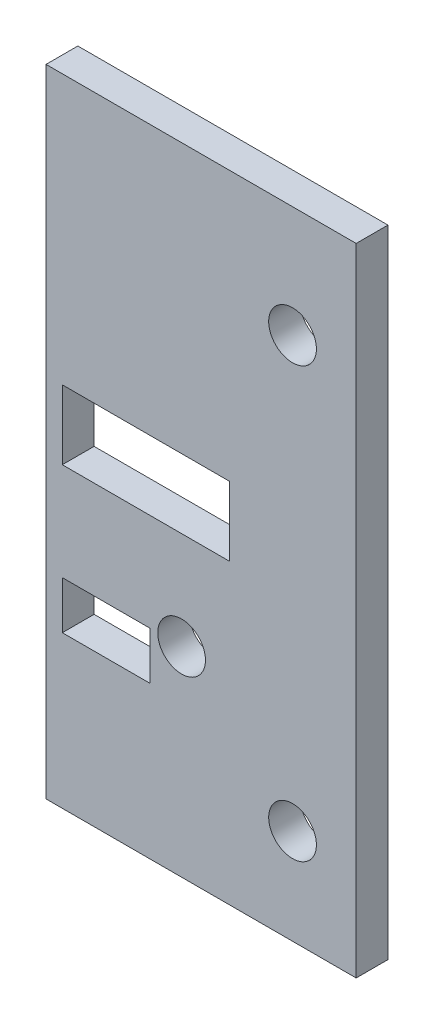
ISO-10303-21;
HEADER;
FILE_DESCRIPTION(('STEP AP214'),'2;1');
FILE_NAME('part.step','',(''),(''),'','','');
FILE_SCHEMA(('AUTOMOTIVE_DESIGN { 1 0 10303 214 1 1 1 1 }'));
ENDSEC;
DATA;
#1=APPLICATION_CONTEXT('core data for automotive mechanical design processes');
#2=APPLICATION_PROTOCOL_DEFINITION('international standard','automotive_design',2000,#1);
#3=PRODUCT_CONTEXT('',#1,'mechanical');
#4=PRODUCT('Part','Part','',(#3));
#5=PRODUCT_RELATED_PRODUCT_CATEGORY('part','',(#4));
#6=PRODUCT_DEFINITION_FORMATION('','',#4);
#7=PRODUCT_DEFINITION_CONTEXT('part definition',#1,'design');
#8=PRODUCT_DEFINITION('design','',#6,#7);
#9=PRODUCT_DEFINITION_SHAPE('','',#8);
#10=(LENGTH_UNIT() NAMED_UNIT(*) SI_UNIT(.MILLI.,.METRE.));
#11=(NAMED_UNIT(*) PLANE_ANGLE_UNIT() SI_UNIT($,.RADIAN.));
#12=(NAMED_UNIT(*) SI_UNIT($,.STERADIAN.) SOLID_ANGLE_UNIT());
#13=UNCERTAINTY_MEASURE_WITH_UNIT(LENGTH_MEASURE(1.E-05),#10,'distance_accuracy_value','');
#14=(GEOMETRIC_REPRESENTATION_CONTEXT(3) GLOBAL_UNCERTAINTY_ASSIGNED_CONTEXT((#13)) GLOBAL_UNIT_ASSIGNED_CONTEXT((#10,
#11,#12)) REPRESENTATION_CONTEXT('',''));
#15=CARTESIAN_POINT('',(0.,0.,0.));
#16=DIRECTION('',(0.,0.,1.));
#17=DIRECTION('',(1.,0.,0.));
#18=AXIS2_PLACEMENT_3D('',#15,#16,#17);
#19=CARTESIAN_POINT('',(0.,0.,2.));
#20=DIRECTION('',(0.,0.,1.));
#21=DIRECTION('',(1.,0.,0.));
#22=AXIS2_PLACEMENT_3D('',#19,#20,#21);
#23=PLANE('',#22);
#24=CARTESIAN_POINT('',(5.75,-14.,2.));
#25=DIRECTION('',(0.,0.,1.));
#26=DIRECTION('',(1.,0.,0.));
#27=AXIS2_PLACEMENT_3D('',#24,#25,#26);
#28=CIRCLE('',#27,1.5);
#29=CARTESIAN_POINT('',(7.25,-14.,2.));
#30=VERTEX_POINT('',#29);
#31=EDGE_CURVE('E324',#30,#30,#28,.T.);
#32=ORIENTED_EDGE('',*,*,#31,.F.);
#33=EDGE_LOOP('',(#32));
#34=FACE_BOUND('',#33,.T.);
#35=CARTESIAN_POINT('',(5.75,13.,2.));
#36=DIRECTION('',(0.,0.,1.));
#37=DIRECTION('',(1.,0.,0.));
#38=AXIS2_PLACEMENT_3D('',#35,#36,#37);
#39=CIRCLE('',#38,1.5);
#40=CARTESIAN_POINT('',(7.25,13.,2.));
#41=VERTEX_POINT('',#40);
#42=EDGE_CURVE('E149',#41,#41,#39,.T.);
#43=ORIENTED_EDGE('',*,*,#42,.F.);
#44=EDGE_LOOP('',(#43));
#45=FACE_BOUND('',#44,.T.);
#46=DIRECTION('',(0.,1.,0.));
#47=VECTOR('',#46,1.);
#48=CARTESIAN_POINT('',(-3.22648049851816,0.,2.));
#49=LINE('',#48,#47);
#50=CARTESIAN_POINT('',(-3.22648049851816,-10.4359985929143,2.));
#51=VERTEX_POINT('',#50);
#52=CARTESIAN_POINT('',(-3.22648049851816,-7.43599859291428,2.));
#53=VERTEX_POINT('',#52);
#54=EDGE_CURVE('E56',#51,#53,#49,.T.);
#55=ORIENTED_EDGE('',*,*,#54,.F.);
#56=DIRECTION('',(-1.,0.,0.));
#57=VECTOR('',#56,1.);
#58=CARTESIAN_POINT('',(0.,-10.4359985929143,2.));
#59=LINE('',#58,#57);
#60=CARTESIAN_POINT('',(-8.72648049851816,-10.4359985929143,2.));
#61=VERTEX_POINT('',#60);
#62=EDGE_CURVE('E143',#51,#61,#59,.T.);
#63=ORIENTED_EDGE('',*,*,#62,.T.);
#64=DIRECTION('',(0.,1.,0.));
#65=VECTOR('',#64,1.);
#66=CARTESIAN_POINT('',(-8.72648049851816,0.,2.));
#67=LINE('',#66,#65);
#68=CARTESIAN_POINT('',(-8.72648049851816,-7.43599859291428,2.));
#69=VERTEX_POINT('',#68);
#70=EDGE_CURVE('E146',#61,#69,#67,.T.);
#71=ORIENTED_EDGE('',*,*,#70,.T.);
#72=DIRECTION('',(-1.,0.,0.));
#73=VECTOR('',#72,1.);
#74=CARTESIAN_POINT('',(0.,-7.43599859291428,2.));
#75=LINE('',#74,#73);
#76=EDGE_CURVE('E155',#53,#69,#75,.T.);
#77=ORIENTED_EDGE('',*,*,#76,.F.);
#78=EDGE_LOOP('',(#55,#63,#71,#77));
#79=FACE_BOUND('',#78,.T.);
#80=CARTESIAN_POINT('',(-1.22648049851816,-7.43599859291428,2.));
#81=DIRECTION('',(0.,0.,1.));
#82=DIRECTION('',(1.,0.,0.));
#83=AXIS2_PLACEMENT_3D('',#80,#81,#82);
#84=CIRCLE('',#83,1.5);
#85=CARTESIAN_POINT('',(0.273519501481839,-7.43599859291428,2.));
#86=VERTEX_POINT('',#85);
#87=EDGE_CURVE('E162',#86,#86,#84,.T.);
#88=ORIENTED_EDGE('',*,*,#87,.F.);
#89=EDGE_LOOP('',(#88));
#90=FACE_BOUND('',#89,.T.);
#91=DIRECTION('',(0.,-1.,0.));
#92=VECTOR('',#91,1.);
#93=CARTESIAN_POINT('',(-9.75,-20.,2.));
#94=LINE('',#93,#92);
#95=CARTESIAN_POINT('',(-9.75,20.,2.));
#96=VERTEX_POINT('',#95);
#97=CARTESIAN_POINT('',(-9.75,-20.,2.));
#98=VERTEX_POINT('',#97);
#99=EDGE_CURVE('E200',#96,#98,#94,.T.);
#100=ORIENTED_EDGE('',*,*,#99,.T.);
#101=DIRECTION('',(1.,0.,0.));
#102=VECTOR('',#101,1.);
#103=CARTESIAN_POINT('',(9.75,-20.,2.));
#104=LINE('',#103,#102);
#105=CARTESIAN_POINT('',(9.75,-20.,2.));
#106=VERTEX_POINT('',#105);
#107=EDGE_CURVE('E203',#98,#106,#104,.T.);
#108=ORIENTED_EDGE('',*,*,#107,.T.);
#109=DIRECTION('',(0.,1.,0.));
#110=VECTOR('',#109,1.);
#111=CARTESIAN_POINT('',(9.75,-20.,2.));
#112=LINE('',#111,#110);
#113=CARTESIAN_POINT('',(9.75,20.,2.));
#114=VERTEX_POINT('',#113);
#115=EDGE_CURVE('E206',#106,#114,#112,.T.);
#116=ORIENTED_EDGE('',*,*,#115,.T.);
#117=DIRECTION('',(-1.,0.,0.));
#118=VECTOR('',#117,1.);
#119=CARTESIAN_POINT('',(9.75,20.,2.));
#120=LINE('',#119,#118);
#121=EDGE_CURVE('E208',#114,#96,#120,.T.);
#122=ORIENTED_EDGE('',*,*,#121,.T.);
#123=EDGE_LOOP('',(#100,#108,#116,#122));
#124=FACE_BOUND('',#123,.T.);
#125=DIRECTION('',(0.,1.,0.));
#126=VECTOR('',#125,1.);
#127=CARTESIAN_POINT('',(1.77351950148184,0.,2.));
#128=LINE('',#127,#126);
#129=CARTESIAN_POINT('',(1.77351950148184,-1.28955750015885,2.));
#130=VERTEX_POINT('',#129);
#131=CARTESIAN_POINT('',(1.77351950148184,3.06400140708572,2.));
#132=VERTEX_POINT('',#131);
#133=EDGE_CURVE('E179',#130,#132,#128,.T.);
#134=ORIENTED_EDGE('',*,*,#133,.F.);
#135=DIRECTION('',(-1.,0.,0.));
#136=VECTOR('',#135,1.);
#137=CARTESIAN_POINT('',(0.,-1.28955750015885,2.));
#138=LINE('',#137,#136);
#139=CARTESIAN_POINT('',(-8.72648049851816,-1.28955750015885,2.));
#140=VERTEX_POINT('',#139);
#141=EDGE_CURVE('E48',#130,#140,#138,.T.);
#142=ORIENTED_EDGE('',*,*,#141,.T.);
#143=DIRECTION('',(0.,1.,0.));
#144=VECTOR('',#143,1.);
#145=CARTESIAN_POINT('',(-8.72648049851816,0.,2.));
#146=LINE('',#145,#144);
#147=CARTESIAN_POINT('',(-8.72648049851816,3.06400140708572,2.));
#148=VERTEX_POINT('',#147);
#149=EDGE_CURVE('E169',#140,#148,#146,.T.);
#150=ORIENTED_EDGE('',*,*,#149,.T.);
#151=DIRECTION('',(-1.,0.,0.));
#152=VECTOR('',#151,1.);
#153=CARTESIAN_POINT('',(0.,3.06400140708572,2.));
#154=LINE('',#153,#152);
#155=EDGE_CURVE('E183',#132,#148,#154,.T.);
#156=ORIENTED_EDGE('',*,*,#155,.F.);
#157=EDGE_LOOP('',(#134,#142,#150,#156));
#158=FACE_BOUND('',#157,.T.);
#159=ADVANCED_FACE('F33',(#34,#45,#79,#90,#124,#158),#23,.T.);
#160=CARTESIAN_POINT('',(0.,0.,0.));
#161=DIRECTION('',(0.,0.,1.));
#162=DIRECTION('',(1.,0.,0.));
#163=AXIS2_PLACEMENT_3D('',#160,#161,#162);
#164=PLANE('',#163);
#165=CARTESIAN_POINT('',(5.75,-14.,0.));
#166=DIRECTION('',(0.,0.,1.));
#167=DIRECTION('',(1.,0.,0.));
#168=AXIS2_PLACEMENT_3D('',#165,#166,#167);
#169=CIRCLE('',#168,1.5);
#170=CARTESIAN_POINT('',(7.25,-14.,0.));
#171=VERTEX_POINT('',#170);
#172=EDGE_CURVE('E180',#171,#171,#169,.T.);
#173=ORIENTED_EDGE('',*,*,#172,.T.);
#174=EDGE_LOOP('',(#173));
#175=FACE_BOUND('',#174,.T.);
#176=CARTESIAN_POINT('',(5.75,13.,0.));
#177=DIRECTION('',(0.,0.,1.));
#178=DIRECTION('',(1.,0.,0.));
#179=AXIS2_PLACEMENT_3D('',#176,#177,#178);
#180=CIRCLE('',#179,1.5);
#181=CARTESIAN_POINT('',(7.25,13.,0.));
#182=VERTEX_POINT('',#181);
#183=EDGE_CURVE('E325',#182,#182,#180,.T.);
#184=ORIENTED_EDGE('',*,*,#183,.T.);
#185=EDGE_LOOP('',(#184));
#186=FACE_BOUND('',#185,.T.);
#187=DIRECTION('',(0.,-1.,0.));
#188=VECTOR('',#187,1.);
#189=CARTESIAN_POINT('',(-9.75,-20.,0.));
#190=LINE('',#189,#188);
#191=CARTESIAN_POINT('',(-9.75,20.,0.));
#192=VERTEX_POINT('',#191);
#193=CARTESIAN_POINT('',(-9.75,-20.,0.));
#194=VERTEX_POINT('',#193);
#195=EDGE_CURVE('E197',#192,#194,#190,.T.);
#196=ORIENTED_EDGE('',*,*,#195,.F.);
#197=DIRECTION('',(-1.,0.,0.));
#198=VECTOR('',#197,1.);
#199=CARTESIAN_POINT('',(9.75,20.,0.));
#200=LINE('',#199,#198);
#201=CARTESIAN_POINT('',(9.75,20.,0.));
#202=VERTEX_POINT('',#201);
#203=EDGE_CURVE('E204',#202,#192,#200,.T.);
#204=ORIENTED_EDGE('',*,*,#203,.F.);
#205=DIRECTION('',(0.,1.,0.));
#206=VECTOR('',#205,1.);
#207=CARTESIAN_POINT('',(9.75,-20.,0.));
#208=LINE('',#207,#206);
#209=CARTESIAN_POINT('',(9.75,-20.,0.));
#210=VERTEX_POINT('',#209);
#211=EDGE_CURVE('E215',#210,#202,#208,.T.);
#212=ORIENTED_EDGE('',*,*,#211,.F.);
#213=DIRECTION('',(1.,0.,0.));
#214=VECTOR('',#213,1.);
#215=CARTESIAN_POINT('',(9.75,-20.,0.));
#216=LINE('',#215,#214);
#217=EDGE_CURVE('E213',#194,#210,#216,.T.);
#218=ORIENTED_EDGE('',*,*,#217,.F.);
#219=EDGE_LOOP('',(#196,#204,#212,#218));
#220=FACE_BOUND('',#219,.T.);
#221=CARTESIAN_POINT('',(-1.22648049851816,-7.43599859291428,0.));
#222=DIRECTION('',(0.,0.,1.));
#223=DIRECTION('',(1.,0.,0.));
#224=AXIS2_PLACEMENT_3D('',#221,#222,#223);
#225=CIRCLE('',#224,1.5);
#226=CARTESIAN_POINT('',(0.273519501481839,-7.43599859291428,0.));
#227=VERTEX_POINT('',#226);
#228=EDGE_CURVE('E194',#227,#227,#225,.T.);
#229=ORIENTED_EDGE('',*,*,#228,.T.);
#230=EDGE_LOOP('',(#229));
#231=FACE_BOUND('',#230,.T.);
#232=DIRECTION('',(-1.,0.,0.));
#233=VECTOR('',#232,1.);
#234=CARTESIAN_POINT('',(0.,-10.4359985929143,0.));
#235=LINE('',#234,#233);
#236=CARTESIAN_POINT('',(-3.22648049851816,-10.4359985929143,0.));
#237=VERTEX_POINT('',#236);
#238=CARTESIAN_POINT('',(-8.72648049851816,-10.4359985929143,0.));
#239=VERTEX_POINT('',#238);
#240=EDGE_CURVE('E131',#237,#239,#235,.T.);
#241=ORIENTED_EDGE('',*,*,#240,.F.);
#242=DIRECTION('',(0.,1.,0.));
#243=VECTOR('',#242,1.);
#244=CARTESIAN_POINT('',(-3.22648049851816,0.,0.));
#245=LINE('',#244,#243);
#246=CARTESIAN_POINT('',(-3.22648049851816,-7.43599859291428,0.));
#247=VERTEX_POINT('',#246);
#248=EDGE_CURVE('E125',#237,#247,#245,.T.);
#249=ORIENTED_EDGE('',*,*,#248,.T.);
#250=DIRECTION('',(-1.,0.,0.));
#251=VECTOR('',#250,1.);
#252=CARTESIAN_POINT('',(0.,-7.43599859291428,0.));
#253=LINE('',#252,#251);
#254=CARTESIAN_POINT('',(-8.72648049851816,-7.43599859291428,0.));
#255=VERTEX_POINT('',#254);
#256=EDGE_CURVE('E134',#247,#255,#253,.T.);
#257=ORIENTED_EDGE('',*,*,#256,.T.);
#258=DIRECTION('',(0.,1.,0.));
#259=VECTOR('',#258,1.);
#260=CARTESIAN_POINT('',(-8.72648049851816,0.,0.));
#261=LINE('',#260,#259);
#262=EDGE_CURVE('E139',#239,#255,#261,.T.);
#263=ORIENTED_EDGE('',*,*,#262,.F.);
#264=EDGE_LOOP('',(#241,#249,#257,#263));
#265=FACE_BOUND('',#264,.T.);
#266=DIRECTION('',(-1.,0.,0.));
#267=VECTOR('',#266,1.);
#268=CARTESIAN_POINT('',(0.,-1.28955750015885,0.));
#269=LINE('',#268,#267);
#270=CARTESIAN_POINT('',(1.77351950148184,-1.28955750015885,0.));
#271=VERTEX_POINT('',#270);
#272=CARTESIAN_POINT('',(-8.72648049851816,-1.28955750015885,0.));
#273=VERTEX_POINT('',#272);
#274=EDGE_CURVE('E166',#271,#273,#269,.T.);
#275=ORIENTED_EDGE('',*,*,#274,.F.);
#276=DIRECTION('',(0.,1.,0.));
#277=VECTOR('',#276,1.);
#278=CARTESIAN_POINT('',(1.77351950148184,0.,0.));
#279=LINE('',#278,#277);
#280=CARTESIAN_POINT('',(1.77351950148184,3.06400140708572,0.));
#281=VERTEX_POINT('',#280);
#282=EDGE_CURVE('E168',#271,#281,#279,.T.);
#283=ORIENTED_EDGE('',*,*,#282,.T.);
#284=DIRECTION('',(-1.,0.,0.));
#285=VECTOR('',#284,1.);
#286=CARTESIAN_POINT('',(0.,3.06400140708572,0.));
#287=LINE('',#286,#285);
#288=CARTESIAN_POINT('',(-8.72648049851816,3.06400140708572,0.));
#289=VERTEX_POINT('',#288);
#290=EDGE_CURVE('E172',#281,#289,#287,.T.);
#291=ORIENTED_EDGE('',*,*,#290,.T.);
#292=DIRECTION('',(0.,1.,0.));
#293=VECTOR('',#292,1.);
#294=CARTESIAN_POINT('',(-8.72648049851816,0.,0.));
#295=LINE('',#294,#293);
#296=EDGE_CURVE('E175',#273,#289,#295,.T.);
#297=ORIENTED_EDGE('',*,*,#296,.F.);
#298=EDGE_LOOP('',(#275,#283,#291,#297));
#299=FACE_BOUND('',#298,.T.);
#300=ADVANCED_FACE('F141',(#175,#186,#220,#231,#265,#299),#164,.F.);
#301=CARTESIAN_POINT('',(-9.75,-20.,2.));
#302=DIRECTION('',(1.,0.,0.));
#303=DIRECTION('',(0.,0.,-1.));
#304=AXIS2_PLACEMENT_3D('',#301,#302,#303);
#305=PLANE('',#304);
#306=ORIENTED_EDGE('',*,*,#195,.T.);
#307=DIRECTION('',(0.,0.,-1.));
#308=VECTOR('',#307,1.);
#309=CARTESIAN_POINT('',(-9.75,-20.,2.));
#310=LINE('',#309,#308);
#311=EDGE_CURVE('E11',#98,#194,#310,.T.);
#312=ORIENTED_EDGE('',*,*,#311,.F.);
#313=ORIENTED_EDGE('',*,*,#99,.F.);
#314=DIRECTION('',(0.,0.,-1.));
#315=VECTOR('',#314,1.);
#316=CARTESIAN_POINT('',(-9.75,20.,2.));
#317=LINE('',#316,#315);
#318=EDGE_CURVE('E210',#96,#192,#317,.T.);
#319=ORIENTED_EDGE('',*,*,#318,.T.);
#320=EDGE_LOOP('',(#306,#312,#313,#319));
#321=FACE_BOUND('',#320,.T.);
#322=ADVANCED_FACE('F35',(#321),#305,.F.);
#323=CARTESIAN_POINT('',(9.75,-20.,2.));
#324=DIRECTION('',(0.,1.,0.));
#325=DIRECTION('',(-1.,0.,0.));
#326=AXIS2_PLACEMENT_3D('',#323,#324,#325);
#327=PLANE('',#326);
#328=ORIENTED_EDGE('',*,*,#217,.T.);
#329=DIRECTION('',(0.,0.,-1.));
#330=VECTOR('',#329,1.);
#331=CARTESIAN_POINT('',(9.75,-20.,2.));
#332=LINE('',#331,#330);
#333=EDGE_CURVE('E41',#106,#210,#332,.T.);
#334=ORIENTED_EDGE('',*,*,#333,.F.);
#335=ORIENTED_EDGE('',*,*,#107,.F.);
#336=ORIENTED_EDGE('',*,*,#311,.T.);
#337=EDGE_LOOP('',(#328,#334,#335,#336));
#338=FACE_BOUND('',#337,.T.);
#339=ADVANCED_FACE('F243',(#338),#327,.F.);
#340=CARTESIAN_POINT('',(9.75,-20.,2.));
#341=DIRECTION('',(-1.,0.,0.));
#342=DIRECTION('',(0.,0.,1.));
#343=AXIS2_PLACEMENT_3D('',#340,#341,#342);
#344=PLANE('',#343);
#345=ORIENTED_EDGE('',*,*,#211,.T.);
#346=DIRECTION('',(0.,0.,-1.));
#347=VECTOR('',#346,1.);
#348=CARTESIAN_POINT('',(9.75,20.,2.));
#349=LINE('',#348,#347);
#350=EDGE_CURVE('E220',#114,#202,#349,.T.);
#351=ORIENTED_EDGE('',*,*,#350,.F.);
#352=ORIENTED_EDGE('',*,*,#115,.F.);
#353=ORIENTED_EDGE('',*,*,#333,.T.);
#354=EDGE_LOOP('',(#345,#351,#352,#353));
#355=FACE_BOUND('',#354,.T.);
#356=ADVANCED_FACE('F227',(#355),#344,.F.);
#357=CARTESIAN_POINT('',(9.75,20.,2.));
#358=DIRECTION('',(0.,-1.,0.));
#359=DIRECTION('',(0.,0.,-1.));
#360=AXIS2_PLACEMENT_3D('',#357,#358,#359);
#361=PLANE('',#360);
#362=ORIENTED_EDGE('',*,*,#203,.T.);
#363=ORIENTED_EDGE('',*,*,#318,.F.);
#364=ORIENTED_EDGE('',*,*,#121,.F.);
#365=ORIENTED_EDGE('',*,*,#350,.T.);
#366=EDGE_LOOP('',(#362,#363,#364,#365));
#367=FACE_BOUND('',#366,.T.);
#368=ADVANCED_FACE('F236',(#367),#361,.F.);
#369=CARTESIAN_POINT('',(-1.22648049851816,-7.43599859291428,0.));
#370=DIRECTION('',(0.,0.,1.));
#371=DIRECTION('',(1.,0.,0.));
#372=AXIS2_PLACEMENT_3D('',#369,#370,#371);
#373=CYLINDRICAL_SURFACE('',#372,1.5);
#374=ORIENTED_EDGE('',*,*,#228,.F.);
#375=EDGE_LOOP('',(#374));
#376=FACE_BOUND('',#375,.T.);
#377=ORIENTED_EDGE('',*,*,#87,.T.);
#378=EDGE_LOOP('',(#377));
#379=FACE_BOUND('',#378,.T.);
#380=ADVANCED_FACE('F261',(#376,#379),#373,.F.);
#381=CARTESIAN_POINT('',(-3.22648049851816,0.,0.));
#382=DIRECTION('',(1.,0.,0.));
#383=DIRECTION('',(0.,0.,-1.));
#384=AXIS2_PLACEMENT_3D('',#381,#382,#383);
#385=PLANE('',#384);
#386=ORIENTED_EDGE('',*,*,#54,.T.);
#387=DIRECTION('',(0.,0.,1.));
#388=VECTOR('',#387,1.);
#389=CARTESIAN_POINT('',(-3.22648049851816,-7.43599859291428,0.));
#390=LINE('',#389,#388);
#391=EDGE_CURVE('E121',#247,#53,#390,.T.);
#392=ORIENTED_EDGE('',*,*,#391,.F.);
#393=ORIENTED_EDGE('',*,*,#248,.F.);
#394=DIRECTION('',(0.,0.,1.));
#395=VECTOR('',#394,1.);
#396=CARTESIAN_POINT('',(-3.22648049851816,-10.4359985929143,0.));
#397=LINE('',#396,#395);
#398=EDGE_CURVE('E160',#237,#51,#397,.T.);
#399=ORIENTED_EDGE('',*,*,#398,.T.);
#400=EDGE_LOOP('',(#386,#392,#393,#399));
#401=FACE_BOUND('',#400,.T.);
#402=ADVANCED_FACE('F123',(#401),#385,.F.);
#403=CARTESIAN_POINT('',(0.,-10.4359985929143,0.));
#404=DIRECTION('',(0.,1.,0.));
#405=DIRECTION('',(0.,0.,1.));
#406=AXIS2_PLACEMENT_3D('',#403,#404,#405);
#407=PLANE('',#406);
#408=ORIENTED_EDGE('',*,*,#62,.F.);
#409=ORIENTED_EDGE('',*,*,#398,.F.);
#410=ORIENTED_EDGE('',*,*,#240,.T.);
#411=DIRECTION('',(0.,0.,1.));
#412=VECTOR('',#411,1.);
#413=CARTESIAN_POINT('',(-8.72648049851816,-10.4359985929143,0.));
#414=LINE('',#413,#412);
#415=EDGE_CURVE('E163',#239,#61,#414,.T.);
#416=ORIENTED_EDGE('',*,*,#415,.T.);
#417=EDGE_LOOP('',(#408,#409,#410,#416));
#418=FACE_BOUND('',#417,.T.);
#419=ADVANCED_FACE('F272',(#418),#407,.T.);
#420=CARTESIAN_POINT('',(-8.72648049851816,0.,0.));
#421=DIRECTION('',(1.,0.,0.));
#422=DIRECTION('',(0.,0.,-1.));
#423=AXIS2_PLACEMENT_3D('',#420,#421,#422);
#424=PLANE('',#423);
#425=ORIENTED_EDGE('',*,*,#70,.F.);
#426=ORIENTED_EDGE('',*,*,#415,.F.);
#427=ORIENTED_EDGE('',*,*,#262,.T.);
#428=DIRECTION('',(0.,0.,1.));
#429=VECTOR('',#428,1.);
#430=CARTESIAN_POINT('',(-8.72648049851816,-7.43599859291428,0.));
#431=LINE('',#430,#429);
#432=EDGE_CURVE('E130',#255,#69,#431,.T.);
#433=ORIENTED_EDGE('',*,*,#432,.T.);
#434=EDGE_LOOP('',(#425,#426,#427,#433));
#435=FACE_BOUND('',#434,.T.);
#436=ADVANCED_FACE('F281',(#435),#424,.T.);
#437=CARTESIAN_POINT('',(0.,-7.43599859291428,0.));
#438=DIRECTION('',(0.,1.,0.));
#439=DIRECTION('',(0.,0.,1.));
#440=AXIS2_PLACEMENT_3D('',#437,#438,#439);
#441=PLANE('',#440);
#442=ORIENTED_EDGE('',*,*,#76,.T.);
#443=ORIENTED_EDGE('',*,*,#432,.F.);
#444=ORIENTED_EDGE('',*,*,#256,.F.);
#445=ORIENTED_EDGE('',*,*,#391,.T.);
#446=EDGE_LOOP('',(#442,#443,#444,#445));
#447=FACE_BOUND('',#446,.T.);
#448=ADVANCED_FACE('F135',(#447),#441,.F.);
#449=CARTESIAN_POINT('',(0.,-1.28955750015885,0.));
#450=DIRECTION('',(0.,1.,0.));
#451=DIRECTION('',(-1.,0.,0.));
#452=AXIS2_PLACEMENT_3D('',#449,#450,#451);
#453=PLANE('',#452);
#454=ORIENTED_EDGE('',*,*,#141,.F.);
#455=DIRECTION('',(0.,0.,1.));
#456=VECTOR('',#455,1.);
#457=CARTESIAN_POINT('',(1.77351950148184,-1.28955750015885,0.));
#458=LINE('',#457,#456);
#459=EDGE_CURVE('E177',#271,#130,#458,.T.);
#460=ORIENTED_EDGE('',*,*,#459,.F.);
#461=ORIENTED_EDGE('',*,*,#274,.T.);
#462=DIRECTION('',(0.,0.,1.));
#463=VECTOR('',#462,1.);
#464=CARTESIAN_POINT('',(-8.72648049851816,-1.28955750015885,0.));
#465=LINE('',#464,#463);
#466=EDGE_CURVE('E156',#273,#140,#465,.T.);
#467=ORIENTED_EDGE('',*,*,#466,.T.);
#468=EDGE_LOOP('',(#454,#460,#461,#467));
#469=FACE_BOUND('',#468,.T.);
#470=ADVANCED_FACE('F291',(#469),#453,.T.);
#471=CARTESIAN_POINT('',(-8.72648049851816,0.,0.));
#472=DIRECTION('',(1.,0.,0.));
#473=DIRECTION('',(0.,0.,-1.));
#474=AXIS2_PLACEMENT_3D('',#471,#472,#473);
#475=PLANE('',#474);
#476=ORIENTED_EDGE('',*,*,#149,.F.);
#477=ORIENTED_EDGE('',*,*,#466,.F.);
#478=ORIENTED_EDGE('',*,*,#296,.T.);
#479=DIRECTION('',(0.,0.,1.));
#480=VECTOR('',#479,1.);
#481=CARTESIAN_POINT('',(-8.72648049851816,3.06400140708572,0.));
#482=LINE('',#481,#480);
#483=EDGE_CURVE('E189',#289,#148,#482,.T.);
#484=ORIENTED_EDGE('',*,*,#483,.T.);
#485=EDGE_LOOP('',(#476,#477,#478,#484));
#486=FACE_BOUND('',#485,.T.);
#487=ADVANCED_FACE('F287',(#486),#475,.T.);
#488=CARTESIAN_POINT('',(0.,3.06400140708572,0.));
#489=DIRECTION('',(0.,1.,0.));
#490=DIRECTION('',(0.,0.,1.));
#491=AXIS2_PLACEMENT_3D('',#488,#489,#490);
#492=PLANE('',#491);
#493=ORIENTED_EDGE('',*,*,#155,.T.);
#494=ORIENTED_EDGE('',*,*,#483,.F.);
#495=ORIENTED_EDGE('',*,*,#290,.F.);
#496=DIRECTION('',(0.,0.,1.));
#497=VECTOR('',#496,1.);
#498=CARTESIAN_POINT('',(1.77351950148184,3.06400140708572,0.));
#499=LINE('',#498,#497);
#500=EDGE_CURVE('E191',#281,#132,#499,.T.);
#501=ORIENTED_EDGE('',*,*,#500,.T.);
#502=EDGE_LOOP('',(#493,#494,#495,#501));
#503=FACE_BOUND('',#502,.T.);
#504=ADVANCED_FACE('F290',(#503),#492,.F.);
#505=CARTESIAN_POINT('',(1.77351950148184,0.,0.));
#506=DIRECTION('',(1.,0.,0.));
#507=DIRECTION('',(0.,0.,-1.));
#508=AXIS2_PLACEMENT_3D('',#505,#506,#507);
#509=PLANE('',#508);
#510=ORIENTED_EDGE('',*,*,#133,.T.);
#511=ORIENTED_EDGE('',*,*,#500,.F.);
#512=ORIENTED_EDGE('',*,*,#282,.F.);
#513=ORIENTED_EDGE('',*,*,#459,.T.);
#514=EDGE_LOOP('',(#510,#511,#512,#513));
#515=FACE_BOUND('',#514,.T.);
#516=ADVANCED_FACE('F295',(#515),#509,.F.);
#517=CARTESIAN_POINT('',(5.75,13.,0.));
#518=DIRECTION('',(0.,0.,1.));
#519=DIRECTION('',(1.,0.,0.));
#520=AXIS2_PLACEMENT_3D('',#517,#518,#519);
#521=CYLINDRICAL_SURFACE('',#520,1.5);
#522=ORIENTED_EDGE('',*,*,#183,.F.);
#523=EDGE_LOOP('',(#522));
#524=FACE_BOUND('',#523,.T.);
#525=ORIENTED_EDGE('',*,*,#42,.T.);
#526=EDGE_LOOP('',(#525));
#527=FACE_BOUND('',#526,.T.);
#528=ADVANCED_FACE('F298',(#524,#527),#521,.F.);
#529=CARTESIAN_POINT('',(5.75,-14.,0.));
#530=DIRECTION('',(0.,0.,1.));
#531=DIRECTION('',(1.,0.,0.));
#532=AXIS2_PLACEMENT_3D('',#529,#530,#531);
#533=CYLINDRICAL_SURFACE('',#532,1.5);
#534=ORIENTED_EDGE('',*,*,#172,.F.);
#535=EDGE_LOOP('',(#534));
#536=FACE_BOUND('',#535,.T.);
#537=ORIENTED_EDGE('',*,*,#31,.T.);
#538=EDGE_LOOP('',(#537));
#539=FACE_BOUND('',#538,.T.);
#540=ADVANCED_FACE('F314',(#536,#539),#533,.F.);
#541=CLOSED_SHELL('',(#159,#300,#322,#339,#356,#368,#380,#402,#419,#436,#448,#470,#487,#504,
#516,#528,#540));
#542=MANIFOLD_SOLID_BREP('B2',#541);
#543=ADVANCED_BREP_SHAPE_REPRESENTATION('',(#18,#542),#14);
#544=SHAPE_DEFINITION_REPRESENTATION(#9,#543);
ENDSEC;
END-ISO-10303-21;
